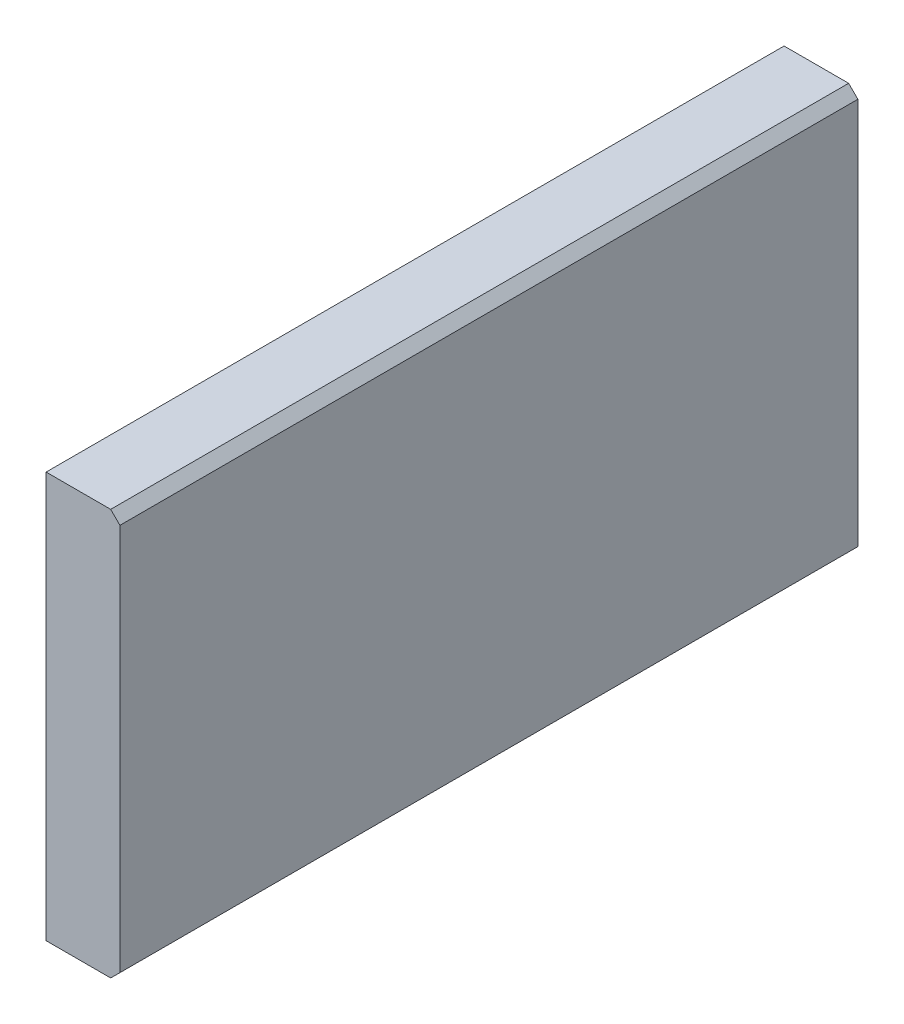
ISO-10303-21;
HEADER;
FILE_DESCRIPTION(('STEP AP214'),'2;1');
FILE_NAME('part.step','',(''),(''),'','','');
FILE_SCHEMA(('AUTOMOTIVE_DESIGN { 1 0 10303 214 1 1 1 1 }'));
ENDSEC;
DATA;
#1=APPLICATION_CONTEXT('core data for automotive mechanical design processes');
#2=APPLICATION_PROTOCOL_DEFINITION('international standard','automotive_design',2000,#1);
#3=PRODUCT_CONTEXT('',#1,'mechanical');
#4=PRODUCT('Part','Part','',(#3));
#5=PRODUCT_RELATED_PRODUCT_CATEGORY('part','',(#4));
#6=PRODUCT_DEFINITION_FORMATION('','',#4);
#7=PRODUCT_DEFINITION_CONTEXT('part definition',#1,'design');
#8=PRODUCT_DEFINITION('design','',#6,#7);
#9=PRODUCT_DEFINITION_SHAPE('','',#8);
#10=(LENGTH_UNIT() NAMED_UNIT(*) SI_UNIT(.MILLI.,.METRE.));
#11=(NAMED_UNIT(*) PLANE_ANGLE_UNIT() SI_UNIT($,.RADIAN.));
#12=(NAMED_UNIT(*) SI_UNIT($,.STERADIAN.) SOLID_ANGLE_UNIT());
#13=UNCERTAINTY_MEASURE_WITH_UNIT(LENGTH_MEASURE(1.E-05),#10,'distance_accuracy_value','');
#14=(GEOMETRIC_REPRESENTATION_CONTEXT(3) GLOBAL_UNCERTAINTY_ASSIGNED_CONTEXT((#13)) GLOBAL_UNIT_ASSIGNED_CONTEXT((#10,
#11,#12)) REPRESENTATION_CONTEXT('',''));
#15=CARTESIAN_POINT('',(0.,0.,0.));
#16=DIRECTION('',(0.,0.,1.));
#17=DIRECTION('',(1.,0.,0.));
#18=AXIS2_PLACEMENT_3D('',#15,#16,#17);
#19=CARTESIAN_POINT('',(32.,-22.,40.));
#20=DIRECTION('',(0.,0.,-1.));
#21=DIRECTION('',(-1.,0.,0.));
#22=AXIS2_PLACEMENT_3D('',#19,#20,#21);
#23=PLANE('',#22);
#24=DIRECTION('',(-1.,0.,0.));
#25=VECTOR('',#24,1.);
#26=CARTESIAN_POINT('',(32.,-22.,40.));
#27=LINE('',#26,#25);
#28=CARTESIAN_POINT('',(31.,-22.,40.));
#29=VERTEX_POINT('',#28);
#30=CARTESIAN_POINT('',(24.,-22.,40.));
#31=VERTEX_POINT('',#30);
#32=EDGE_CURVE('E91',#29,#31,#27,.T.);
#33=ORIENTED_EDGE('',*,*,#32,.F.);
#34=DIRECTION('',(-0.707106781186552,-0.707106781186543,0.));
#35=VECTOR('',#34,1.);
#36=CARTESIAN_POINT('',(32.,-21.,40.));
#37=LINE('',#36,#35);
#38=CARTESIAN_POINT('',(32.,-21.,40.));
#39=VERTEX_POINT('',#38);
#40=EDGE_CURVE('E48',#29,#39,#37,.F.);
#41=ORIENTED_EDGE('',*,*,#40,.T.);
#42=DIRECTION('',(0.,-1.,0.));
#43=VECTOR('',#42,1.);
#44=CARTESIAN_POINT('',(32.,-22.,40.));
#45=LINE('',#44,#43);
#46=CARTESIAN_POINT('',(32.,21.,40.));
#47=VERTEX_POINT('',#46);
#48=EDGE_CURVE('E123',#47,#39,#45,.T.);
#49=ORIENTED_EDGE('',*,*,#48,.F.);
#50=DIRECTION('',(0.707106781186552,-0.707106781186543,0.));
#51=VECTOR('',#50,1.);
#52=CARTESIAN_POINT('',(32.,21.,40.));
#53=LINE('',#52,#51);
#54=CARTESIAN_POINT('',(31.,22.,40.));
#55=VERTEX_POINT('',#54);
#56=EDGE_CURVE('E55',#47,#55,#53,.F.);
#57=ORIENTED_EDGE('',*,*,#56,.T.);
#58=DIRECTION('',(-1.,0.,0.));
#59=VECTOR('',#58,1.);
#60=CARTESIAN_POINT('',(32.,22.,40.));
#61=LINE('',#60,#59);
#62=CARTESIAN_POINT('',(24.,22.,40.));
#63=VERTEX_POINT('',#62);
#64=EDGE_CURVE('E109',#55,#63,#61,.T.);
#65=ORIENTED_EDGE('',*,*,#64,.T.);
#66=DIRECTION('',(0.,-1.,0.));
#67=VECTOR('',#66,1.);
#68=CARTESIAN_POINT('',(24.,-22.,40.));
#69=LINE('',#68,#67);
#70=EDGE_CURVE('E105',#63,#31,#69,.T.);
#71=ORIENTED_EDGE('',*,*,#70,.T.);
#72=EDGE_LOOP('',(#33,#41,#49,#57,#65,#71));
#73=FACE_BOUND('',#72,.T.);
#74=ADVANCED_FACE('F39',(#73),#23,.F.);
#75=CARTESIAN_POINT('',(32.,-22.,40.));
#76=DIRECTION('',(0.,1.,0.));
#77=DIRECTION('',(0.,0.,1.));
#78=AXIS2_PLACEMENT_3D('',#75,#76,#77);
#79=PLANE('',#78);
#80=DIRECTION('',(-1.,0.,0.));
#81=VECTOR('',#80,1.);
#82=CARTESIAN_POINT('',(32.,-22.,-40.));
#83=LINE('',#82,#81);
#84=CARTESIAN_POINT('',(31.,-22.,-40.));
#85=VERTEX_POINT('',#84);
#86=CARTESIAN_POINT('',(24.,-22.,-40.));
#87=VERTEX_POINT('',#86);
#88=EDGE_CURVE('E99',#85,#87,#83,.T.);
#89=ORIENTED_EDGE('',*,*,#88,.F.);
#90=DIRECTION('',(0.,0.,1.));
#91=VECTOR('',#90,1.);
#92=CARTESIAN_POINT('',(31.,-22.,40.));
#93=LINE('',#92,#91);
#94=EDGE_CURVE('E63',#85,#29,#93,.T.);
#95=ORIENTED_EDGE('',*,*,#94,.T.);
#96=ORIENTED_EDGE('',*,*,#32,.T.);
#97=DIRECTION('',(0.,0.,-1.));
#98=VECTOR('',#97,1.);
#99=CARTESIAN_POINT('',(24.,-22.,40.));
#100=LINE('',#99,#98);
#101=EDGE_CURVE('E94',#31,#87,#100,.T.);
#102=ORIENTED_EDGE('',*,*,#101,.T.);
#103=EDGE_LOOP('',(#89,#95,#96,#102));
#104=FACE_BOUND('',#103,.T.);
#105=ADVANCED_FACE('F93',(#104),#79,.F.);
#106=CARTESIAN_POINT('',(32.,-22.,-40.));
#107=DIRECTION('',(0.,0.,1.));
#108=DIRECTION('',(1.,0.,0.));
#109=AXIS2_PLACEMENT_3D('',#106,#107,#108);
#110=PLANE('',#109);
#111=DIRECTION('',(0.,1.,0.));
#112=VECTOR('',#111,1.);
#113=CARTESIAN_POINT('',(32.,-22.,-40.));
#114=LINE('',#113,#112);
#115=CARTESIAN_POINT('',(32.,-21.,-40.));
#116=VERTEX_POINT('',#115);
#117=CARTESIAN_POINT('',(32.,21.,-40.));
#118=VERTEX_POINT('',#117);
#119=EDGE_CURVE('E117',#116,#118,#114,.T.);
#120=ORIENTED_EDGE('',*,*,#119,.F.);
#121=DIRECTION('',(0.707106781186552,0.707106781186543,0.));
#122=VECTOR('',#121,1.);
#123=CARTESIAN_POINT('',(32.,-21.,-40.));
#124=LINE('',#123,#122);
#125=EDGE_CURVE('E135',#116,#85,#124,.F.);
#126=ORIENTED_EDGE('',*,*,#125,.T.);
#127=ORIENTED_EDGE('',*,*,#88,.T.);
#128=DIRECTION('',(0.,1.,0.));
#129=VECTOR('',#128,1.);
#130=CARTESIAN_POINT('',(24.,-22.,-40.));
#131=LINE('',#130,#129);
#132=CARTESIAN_POINT('',(24.,22.,-40.));
#133=VERTEX_POINT('',#132);
#134=EDGE_CURVE('E107',#87,#133,#131,.T.);
#135=ORIENTED_EDGE('',*,*,#134,.T.);
#136=DIRECTION('',(-1.,0.,0.));
#137=VECTOR('',#136,1.);
#138=CARTESIAN_POINT('',(32.,22.,-40.));
#139=LINE('',#138,#137);
#140=CARTESIAN_POINT('',(31.,22.,-40.));
#141=VERTEX_POINT('',#140);
#142=EDGE_CURVE('E125',#141,#133,#139,.T.);
#143=ORIENTED_EDGE('',*,*,#142,.F.);
#144=DIRECTION('',(-0.707106781186552,0.707106781186543,0.));
#145=VECTOR('',#144,1.);
#146=CARTESIAN_POINT('',(32.,21.,-40.));
#147=LINE('',#146,#145);
#148=EDGE_CURVE('E133',#141,#118,#147,.F.);
#149=ORIENTED_EDGE('',*,*,#148,.T.);
#150=EDGE_LOOP('',(#120,#126,#127,#135,#143,#149));
#151=FACE_BOUND('',#150,.T.);
#152=ADVANCED_FACE('F148',(#151),#110,.F.);
#153=CARTESIAN_POINT('',(32.,22.,40.));
#154=DIRECTION('',(0.,-1.,0.));
#155=DIRECTION('',(0.,0.,-1.));
#156=AXIS2_PLACEMENT_3D('',#153,#154,#155);
#157=PLANE('',#156);
#158=ORIENTED_EDGE('',*,*,#64,.F.);
#159=DIRECTION('',(0.,0.,-1.));
#160=VECTOR('',#159,1.);
#161=CARTESIAN_POINT('',(31.,22.,40.));
#162=LINE('',#161,#160);
#163=EDGE_CURVE('E11',#55,#141,#162,.T.);
#164=ORIENTED_EDGE('',*,*,#163,.T.);
#165=ORIENTED_EDGE('',*,*,#142,.T.);
#166=DIRECTION('',(0.,0.,1.));
#167=VECTOR('',#166,1.);
#168=CARTESIAN_POINT('',(24.,22.,40.));
#169=LINE('',#168,#167);
#170=EDGE_CURVE('E121',#133,#63,#169,.T.);
#171=ORIENTED_EDGE('',*,*,#170,.T.);
#172=EDGE_LOOP('',(#158,#164,#165,#171));
#173=FACE_BOUND('',#172,.T.);
#174=ADVANCED_FACE('F154',(#173),#157,.F.);
#175=CARTESIAN_POINT('',(32.,0.,0.));
#176=DIRECTION('',(-1.,0.,0.));
#177=DIRECTION('',(0.,0.,1.));
#178=AXIS2_PLACEMENT_3D('',#175,#176,#177);
#179=PLANE('',#178);
#180=ORIENTED_EDGE('',*,*,#48,.T.);
#181=DIRECTION('',(0.,0.,-1.));
#182=VECTOR('',#181,1.);
#183=CARTESIAN_POINT('',(32.,-21.,0.));
#184=LINE('',#183,#182);
#185=EDGE_CURVE('E130',#39,#116,#184,.T.);
#186=ORIENTED_EDGE('',*,*,#185,.T.);
#187=ORIENTED_EDGE('',*,*,#119,.T.);
#188=DIRECTION('',(0.,0.,1.));
#189=VECTOR('',#188,1.);
#190=CARTESIAN_POINT('',(32.,21.,0.));
#191=LINE('',#190,#189);
#192=EDGE_CURVE('E98',#118,#47,#191,.T.);
#193=ORIENTED_EDGE('',*,*,#192,.T.);
#194=EDGE_LOOP('',(#180,#186,#187,#193));
#195=FACE_BOUND('',#194,.T.);
#196=ADVANCED_FACE('F142',(#195),#179,.F.);
#197=CARTESIAN_POINT('',(24.,0.,0.));
#198=DIRECTION('',(-1.,0.,0.));
#199=DIRECTION('',(0.,0.,1.));
#200=AXIS2_PLACEMENT_3D('',#197,#198,#199);
#201=PLANE('',#200);
#202=CARTESIAN_POINT('',(24.,4.,-4.));
#203=DIRECTION('',(1.,0.,0.));
#204=DIRECTION('',(0.,0.,-1.));
#205=AXIS2_PLACEMENT_3D('',#202,#203,#204);
#206=CIRCLE('',#205,1.5);
#207=CARTESIAN_POINT('',(24.,4.,-5.5));
#208=VERTEX_POINT('',#207);
#209=EDGE_CURVE('E219',#208,#208,#206,.T.);
#210=ORIENTED_EDGE('',*,*,#209,.T.);
#211=EDGE_LOOP('',(#210));
#212=FACE_BOUND('',#211,.T.);
#213=CARTESIAN_POINT('',(24.,4.,4.));
#214=DIRECTION('',(1.,0.,0.));
#215=DIRECTION('',(0.,0.,-1.));
#216=AXIS2_PLACEMENT_3D('',#213,#214,#215);
#217=CIRCLE('',#216,1.5);
#218=CARTESIAN_POINT('',(24.,4.,2.5));
#219=VERTEX_POINT('',#218);
#220=EDGE_CURVE('E223',#219,#219,#217,.T.);
#221=ORIENTED_EDGE('',*,*,#220,.T.);
#222=EDGE_LOOP('',(#221));
#223=FACE_BOUND('',#222,.T.);
#224=CARTESIAN_POINT('',(24.,-4.,-4.));
#225=DIRECTION('',(1.,0.,0.));
#226=DIRECTION('',(0.,0.,-1.));
#227=AXIS2_PLACEMENT_3D('',#224,#225,#226);
#228=CIRCLE('',#227,1.5);
#229=CARTESIAN_POINT('',(24.,-4.,-5.5));
#230=VERTEX_POINT('',#229);
#231=EDGE_CURVE('E227',#230,#230,#228,.T.);
#232=ORIENTED_EDGE('',*,*,#231,.T.);
#233=EDGE_LOOP('',(#232));
#234=FACE_BOUND('',#233,.T.);
#235=CARTESIAN_POINT('',(24.,-4.,4.));
#236=DIRECTION('',(1.,0.,0.));
#237=DIRECTION('',(0.,0.,-1.));
#238=AXIS2_PLACEMENT_3D('',#235,#236,#237);
#239=CIRCLE('',#238,1.5);
#240=CARTESIAN_POINT('',(24.,-4.,2.5));
#241=VERTEX_POINT('',#240);
#242=EDGE_CURVE('E111',#241,#241,#239,.T.);
#243=ORIENTED_EDGE('',*,*,#242,.T.);
#244=EDGE_LOOP('',(#243));
#245=FACE_BOUND('',#244,.T.);
#246=ORIENTED_EDGE('',*,*,#70,.F.);
#247=ORIENTED_EDGE('',*,*,#170,.F.);
#248=ORIENTED_EDGE('',*,*,#134,.F.);
#249=ORIENTED_EDGE('',*,*,#101,.F.);
#250=EDGE_LOOP('',(#246,#247,#248,#249));
#251=FACE_BOUND('',#250,.T.);
#252=ADVANCED_FACE('F103',(#212,#223,#234,#245,#251),#201,.T.);
#253=CARTESIAN_POINT('',(24.,-4.,4.));
#254=DIRECTION('',(-1.,0.,0.));
#255=DIRECTION('',(0.,0.,1.));
#256=AXIS2_PLACEMENT_3D('',#253,#254,#255);
#257=CYLINDRICAL_SURFACE('',#256,1.5);
#258=ORIENTED_EDGE('',*,*,#242,.F.);
#259=EDGE_LOOP('',(#258));
#260=FACE_BOUND('',#259,.T.);
#261=CARTESIAN_POINT('',(21.2,-4.,4.));
#262=DIRECTION('',(1.,0.,0.));
#263=DIRECTION('',(0.,0.,-1.));
#264=AXIS2_PLACEMENT_3D('',#261,#262,#263);
#265=CIRCLE('',#264,1.5);
#266=CARTESIAN_POINT('',(21.2,-4.,2.5));
#267=VERTEX_POINT('',#266);
#268=EDGE_CURVE('E114',#267,#267,#265,.T.);
#269=ORIENTED_EDGE('',*,*,#268,.T.);
#270=EDGE_LOOP('',(#269));
#271=FACE_BOUND('',#270,.T.);
#272=ADVANCED_FACE('F208',(#260,#271),#257,.T.);
#273=CARTESIAN_POINT('',(21.2,-4.,4.));
#274=DIRECTION('',(1.,0.,0.));
#275=DIRECTION('',(0.,0.,-1.));
#276=AXIS2_PLACEMENT_3D('',#273,#274,#275);
#277=PLANE('',#276);
#278=ORIENTED_EDGE('',*,*,#268,.F.);
#279=EDGE_LOOP('',(#278));
#280=FACE_BOUND('',#279,.T.);
#281=ADVANCED_FACE('F204',(#280),#277,.F.);
#282=CARTESIAN_POINT('',(24.,-4.,-4.));
#283=DIRECTION('',(-1.,0.,0.));
#284=DIRECTION('',(0.,0.,1.));
#285=AXIS2_PLACEMENT_3D('',#282,#283,#284);
#286=CYLINDRICAL_SURFACE('',#285,1.5);
#287=ORIENTED_EDGE('',*,*,#231,.F.);
#288=EDGE_LOOP('',(#287));
#289=FACE_BOUND('',#288,.T.);
#290=CARTESIAN_POINT('',(21.2,-4.,-4.));
#291=DIRECTION('',(1.,0.,0.));
#292=DIRECTION('',(0.,0.,-1.));
#293=AXIS2_PLACEMENT_3D('',#290,#291,#292);
#294=CIRCLE('',#293,1.5);
#295=CARTESIAN_POINT('',(21.2,-4.,-5.5));
#296=VERTEX_POINT('',#295);
#297=EDGE_CURVE('E233',#296,#296,#294,.T.);
#298=ORIENTED_EDGE('',*,*,#297,.T.);
#299=EDGE_LOOP('',(#298));
#300=FACE_BOUND('',#299,.T.);
#301=ADVANCED_FACE('F200',(#289,#300),#286,.T.);
#302=CARTESIAN_POINT('',(21.2,-4.,-4.));
#303=DIRECTION('',(1.,0.,0.));
#304=DIRECTION('',(0.,0.,-1.));
#305=AXIS2_PLACEMENT_3D('',#302,#303,#304);
#306=PLANE('',#305);
#307=ORIENTED_EDGE('',*,*,#297,.F.);
#308=EDGE_LOOP('',(#307));
#309=FACE_BOUND('',#308,.T.);
#310=ADVANCED_FACE('F196',(#309),#306,.F.);
#311=CARTESIAN_POINT('',(24.,4.,4.));
#312=DIRECTION('',(-1.,0.,0.));
#313=DIRECTION('',(0.,0.,1.));
#314=AXIS2_PLACEMENT_3D('',#311,#312,#313);
#315=CYLINDRICAL_SURFACE('',#314,1.5);
#316=ORIENTED_EDGE('',*,*,#220,.F.);
#317=EDGE_LOOP('',(#316));
#318=FACE_BOUND('',#317,.T.);
#319=CARTESIAN_POINT('',(21.2,4.,4.));
#320=DIRECTION('',(1.,0.,0.));
#321=DIRECTION('',(0.,0.,-1.));
#322=AXIS2_PLACEMENT_3D('',#319,#320,#321);
#323=CIRCLE('',#322,1.5);
#324=CARTESIAN_POINT('',(21.2,4.,2.5));
#325=VERTEX_POINT('',#324);
#326=EDGE_CURVE('E238',#325,#325,#323,.T.);
#327=ORIENTED_EDGE('',*,*,#326,.T.);
#328=EDGE_LOOP('',(#327));
#329=FACE_BOUND('',#328,.T.);
#330=ADVANCED_FACE('F192',(#318,#329),#315,.T.);
#331=CARTESIAN_POINT('',(21.2,4.,4.));
#332=DIRECTION('',(1.,0.,0.));
#333=DIRECTION('',(0.,0.,-1.));
#334=AXIS2_PLACEMENT_3D('',#331,#332,#333);
#335=PLANE('',#334);
#336=ORIENTED_EDGE('',*,*,#326,.F.);
#337=EDGE_LOOP('',(#336));
#338=FACE_BOUND('',#337,.T.);
#339=ADVANCED_FACE('F185',(#338),#335,.F.);
#340=CARTESIAN_POINT('',(24.,4.,-4.));
#341=DIRECTION('',(-1.,0.,0.));
#342=DIRECTION('',(0.,0.,1.));
#343=AXIS2_PLACEMENT_3D('',#340,#341,#342);
#344=CYLINDRICAL_SURFACE('',#343,1.5);
#345=ORIENTED_EDGE('',*,*,#209,.F.);
#346=EDGE_LOOP('',(#345));
#347=FACE_BOUND('',#346,.T.);
#348=CARTESIAN_POINT('',(21.2,4.,-4.));
#349=DIRECTION('',(1.,0.,0.));
#350=DIRECTION('',(0.,0.,-1.));
#351=AXIS2_PLACEMENT_3D('',#348,#349,#350);
#352=CIRCLE('',#351,1.5);
#353=CARTESIAN_POINT('',(21.2,4.,-5.5));
#354=VERTEX_POINT('',#353);
#355=EDGE_CURVE('E242',#354,#354,#352,.T.);
#356=ORIENTED_EDGE('',*,*,#355,.T.);
#357=EDGE_LOOP('',(#356));
#358=FACE_BOUND('',#357,.T.);
#359=ADVANCED_FACE('F179',(#347,#358),#344,.T.);
#360=CARTESIAN_POINT('',(21.2,4.,-4.));
#361=DIRECTION('',(1.,0.,0.));
#362=DIRECTION('',(0.,0.,-1.));
#363=AXIS2_PLACEMENT_3D('',#360,#361,#362);
#364=PLANE('',#363);
#365=ORIENTED_EDGE('',*,*,#355,.F.);
#366=EDGE_LOOP('',(#365));
#367=FACE_BOUND('',#366,.T.);
#368=ADVANCED_FACE('F174',(#367),#364,.F.);
#369=CARTESIAN_POINT('',(32.,-21.,0.));
#370=DIRECTION('',(-0.707106781186542,0.707106781186552,0.));
#371=DIRECTION('',(0.,0.,-1.));
#372=AXIS2_PLACEMENT_3D('',#369,#370,#371);
#373=PLANE('',#372);
#374=ORIENTED_EDGE('',*,*,#40,.F.);
#375=ORIENTED_EDGE('',*,*,#94,.F.);
#376=ORIENTED_EDGE('',*,*,#125,.F.);
#377=ORIENTED_EDGE('',*,*,#185,.F.);
#378=EDGE_LOOP('',(#374,#375,#376,#377));
#379=FACE_BOUND('',#378,.T.);
#380=ADVANCED_FACE('F146',(#379),#373,.F.);
#381=CARTESIAN_POINT('',(32.,21.,0.));
#382=DIRECTION('',(-0.707106781186542,-0.707106781186552,0.));
#383=DIRECTION('',(0.,0.,1.));
#384=AXIS2_PLACEMENT_3D('',#381,#382,#383);
#385=PLANE('',#384);
#386=ORIENTED_EDGE('',*,*,#148,.F.);
#387=ORIENTED_EDGE('',*,*,#163,.F.);
#388=ORIENTED_EDGE('',*,*,#56,.F.);
#389=ORIENTED_EDGE('',*,*,#192,.F.);
#390=EDGE_LOOP('',(#386,#387,#388,#389));
#391=FACE_BOUND('',#390,.T.);
#392=ADVANCED_FACE('F42',(#391),#385,.F.);
#393=CLOSED_SHELL('',(#74,#105,#152,#174,#196,#252,#272,#281,#301,#310,#330,#339,#359,#368,#380,#392));
#394=MANIFOLD_SOLID_BREP('B2',#393);
#395=ADVANCED_BREP_SHAPE_REPRESENTATION('',(#18,#394),#14);
#396=SHAPE_DEFINITION_REPRESENTATION(#9,#395);
ENDSEC;
END-ISO-10303-21;
